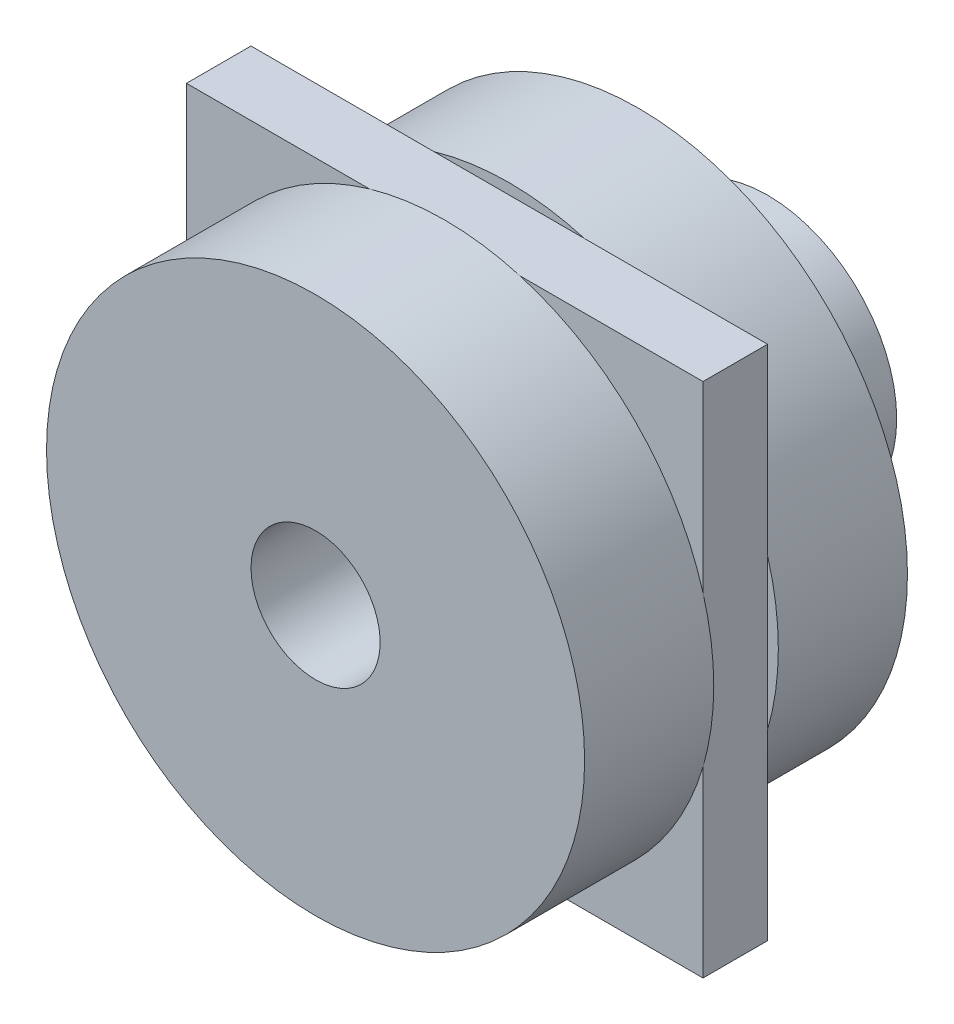
ISO-10303-21;
HEADER;
FILE_DESCRIPTION(('STEP AP214'),'2;1');
FILE_NAME('part.step','',(''),(''),'','','');
FILE_SCHEMA(('AUTOMOTIVE_DESIGN { 1 0 10303 214 1 1 1 1 }'));
ENDSEC;
DATA;
#1=APPLICATION_CONTEXT('core data for automotive mechanical design processes');
#2=APPLICATION_PROTOCOL_DEFINITION('international standard','automotive_design',2000,#1);
#3=PRODUCT_CONTEXT('',#1,'mechanical');
#4=PRODUCT('Part','Part','',(#3));
#5=PRODUCT_RELATED_PRODUCT_CATEGORY('part','',(#4));
#6=PRODUCT_DEFINITION_FORMATION('','',#4);
#7=PRODUCT_DEFINITION_CONTEXT('part definition',#1,'design');
#8=PRODUCT_DEFINITION('design','',#6,#7);
#9=PRODUCT_DEFINITION_SHAPE('','',#8);
#10=(LENGTH_UNIT() NAMED_UNIT(*) SI_UNIT(.MILLI.,.METRE.));
#11=(NAMED_UNIT(*) PLANE_ANGLE_UNIT() SI_UNIT($,.RADIAN.));
#12=(NAMED_UNIT(*) SI_UNIT($,.STERADIAN.) SOLID_ANGLE_UNIT());
#13=UNCERTAINTY_MEASURE_WITH_UNIT(LENGTH_MEASURE(1.E-05),#10,'distance_accuracy_value','');
#14=(GEOMETRIC_REPRESENTATION_CONTEXT(3) GLOBAL_UNCERTAINTY_ASSIGNED_CONTEXT((#13)) GLOBAL_UNIT_ASSIGNED_CONTEXT((#10,
#11,#12)) REPRESENTATION_CONTEXT('',''));
#15=CARTESIAN_POINT('',(0.,0.,0.));
#16=DIRECTION('',(0.,0.,1.));
#17=DIRECTION('',(1.,0.,0.));
#18=AXIS2_PLACEMENT_3D('',#15,#16,#17);
#19=CARTESIAN_POINT('',(0.,0.,9.));
#20=DIRECTION('',(0.,0.,-1.));
#21=DIRECTION('',(-1.,0.,0.));
#22=AXIS2_PLACEMENT_3D('',#19,#20,#21);
#23=PLANE('',#22);
#24=CARTESIAN_POINT('',(0.,0.,9.));
#25=DIRECTION('',(0.,0.,1.));
#26=DIRECTION('',(1.,0.,0.));
#27=AXIS2_PLACEMENT_3D('',#24,#25,#26);
#28=CIRCLE('',#27,12.5);
#29=CARTESIAN_POINT('',(12.,3.5,9.));
#30=VERTEX_POINT('',#29);
#31=CARTESIAN_POINT('',(3.5,12.,9.));
#32=VERTEX_POINT('',#31);
#33=EDGE_CURVE('E151',#30,#32,#28,.T.);
#34=ORIENTED_EDGE('',*,*,#33,.F.);
#35=DIRECTION('',(0.,1.,0.));
#36=VECTOR('',#35,1.);
#37=CARTESIAN_POINT('',(12.,-12.,9.));
#38=LINE('',#37,#36);
#39=CARTESIAN_POINT('',(12.,12.,9.));
#40=VERTEX_POINT('',#39);
#41=EDGE_CURVE('E136',#30,#40,#38,.T.);
#42=ORIENTED_EDGE('',*,*,#41,.T.);
#43=DIRECTION('',(-1.,0.,0.));
#44=VECTOR('',#43,1.);
#45=CARTESIAN_POINT('',(-12.,12.,9.));
#46=LINE('',#45,#44);
#47=EDGE_CURVE('E181',#40,#32,#46,.T.);
#48=ORIENTED_EDGE('',*,*,#47,.T.);
#49=EDGE_LOOP('',(#34,#42,#48));
#50=FACE_BOUND('',#49,.T.);
#51=ADVANCED_FACE('F35',(#50),#23,.F.);
#52=CARTESIAN_POINT('',(-3.5,12.,9.));
#53=VERTEX_POINT('',#52);
#54=CARTESIAN_POINT('',(-12.,3.5,9.));
#55=VERTEX_POINT('',#54);
#56=EDGE_CURVE('E11',#53,#55,#28,.T.);
#57=ORIENTED_EDGE('',*,*,#56,.F.);
#58=CARTESIAN_POINT('',(-12.,12.,9.));
#59=VERTEX_POINT('',#58);
#60=EDGE_CURVE('E133',#53,#59,#46,.T.);
#61=ORIENTED_EDGE('',*,*,#60,.T.);
#62=DIRECTION('',(0.,-1.,0.));
#63=VECTOR('',#62,1.);
#64=CARTESIAN_POINT('',(-12.,-12.,9.));
#65=LINE('',#64,#63);
#66=EDGE_CURVE('E178',#59,#55,#65,.T.);
#67=ORIENTED_EDGE('',*,*,#66,.T.);
#68=EDGE_LOOP('',(#57,#61,#67));
#69=FACE_BOUND('',#68,.T.);
#70=ADVANCED_FACE('F276',(#69),#23,.F.);
#71=CARTESIAN_POINT('',(-12.,-3.5,9.));
#72=VERTEX_POINT('',#71);
#73=CARTESIAN_POINT('',(-3.50000000000001,-12.,9.));
#74=VERTEX_POINT('',#73);
#75=EDGE_CURVE('E44',#72,#74,#28,.T.);
#76=ORIENTED_EDGE('',*,*,#75,.F.);
#77=CARTESIAN_POINT('',(-12.,-12.,9.));
#78=VERTEX_POINT('',#77);
#79=EDGE_CURVE('E179',#72,#78,#65,.T.);
#80=ORIENTED_EDGE('',*,*,#79,.T.);
#81=DIRECTION('',(1.,0.,0.));
#82=VECTOR('',#81,1.);
#83=CARTESIAN_POINT('',(-12.,-12.,9.));
#84=LINE('',#83,#82);
#85=EDGE_CURVE('E184',#78,#74,#84,.T.);
#86=ORIENTED_EDGE('',*,*,#85,.T.);
#87=EDGE_LOOP('',(#76,#80,#86));
#88=FACE_BOUND('',#87,.T.);
#89=ADVANCED_FACE('F282',(#88),#23,.F.);
#90=CARTESIAN_POINT('',(3.50000000000001,-12.,9.));
#91=VERTEX_POINT('',#90);
#92=CARTESIAN_POINT('',(12.,-3.5,9.));
#93=VERTEX_POINT('',#92);
#94=EDGE_CURVE('E53',#91,#93,#28,.T.);
#95=ORIENTED_EDGE('',*,*,#94,.F.);
#96=CARTESIAN_POINT('',(12.,-12.,9.));
#97=VERTEX_POINT('',#96);
#98=EDGE_CURVE('E129',#91,#97,#84,.T.);
#99=ORIENTED_EDGE('',*,*,#98,.T.);
#100=EDGE_CURVE('E126',#97,#93,#38,.T.);
#101=ORIENTED_EDGE('',*,*,#100,.T.);
#102=EDGE_LOOP('',(#95,#99,#101));
#103=FACE_BOUND('',#102,.T.);
#104=ADVANCED_FACE('F128',(#103),#23,.F.);
#105=CARTESIAN_POINT('',(0.,0.,6.));
#106=DIRECTION('',(0.,0.,1.));
#107=DIRECTION('',(1.,0.,0.));
#108=AXIS2_PLACEMENT_3D('',#105,#106,#107);
#109=PLANE('',#108);
#110=DIRECTION('',(0.,1.,0.));
#111=VECTOR('',#110,1.);
#112=CARTESIAN_POINT('',(12.,-12.,6.));
#113=LINE('',#112,#111);
#114=CARTESIAN_POINT('',(12.,-3.5,6.));
#115=VERTEX_POINT('',#114);
#116=CARTESIAN_POINT('',(12.,3.5,6.));
#117=VERTEX_POINT('',#116);
#118=EDGE_CURVE('E156',#115,#117,#113,.T.);
#119=ORIENTED_EDGE('',*,*,#118,.F.);
#120=CARTESIAN_POINT('',(0.,0.,6.));
#121=DIRECTION('',(0.,0.,1.));
#122=DIRECTION('',(1.,0.,0.));
#123=AXIS2_PLACEMENT_3D('',#120,#121,#122);
#124=CIRCLE('',#123,12.5);
#125=EDGE_CURVE('E218',#115,#117,#124,.T.);
#126=ORIENTED_EDGE('',*,*,#125,.T.);
#127=EDGE_LOOP('',(#119,#126));
#128=FACE_BOUND('',#127,.T.);
#129=ADVANCED_FACE('F287',(#128),#109,.T.);
#130=DIRECTION('',(1.,0.,0.));
#131=VECTOR('',#130,1.);
#132=CARTESIAN_POINT('',(-12.,-12.,6.));
#133=LINE('',#132,#131);
#134=CARTESIAN_POINT('',(-3.50000000000001,-12.,6.));
#135=VERTEX_POINT('',#134);
#136=CARTESIAN_POINT('',(3.50000000000001,-12.,6.));
#137=VERTEX_POINT('',#136);
#138=EDGE_CURVE('E158',#135,#137,#133,.T.);
#139=ORIENTED_EDGE('',*,*,#138,.F.);
#140=EDGE_CURVE('E227',#135,#137,#124,.T.);
#141=ORIENTED_EDGE('',*,*,#140,.T.);
#142=EDGE_LOOP('',(#139,#141));
#143=FACE_BOUND('',#142,.T.);
#144=ADVANCED_FACE('F273',(#143),#109,.T.);
#145=DIRECTION('',(0.,-1.,0.));
#146=VECTOR('',#145,1.);
#147=CARTESIAN_POINT('',(-12.,-12.,6.));
#148=LINE('',#147,#146);
#149=CARTESIAN_POINT('',(-12.,3.5,6.));
#150=VERTEX_POINT('',#149);
#151=CARTESIAN_POINT('',(-12.,-3.5,6.));
#152=VERTEX_POINT('',#151);
#153=EDGE_CURVE('E197',#150,#152,#148,.T.);
#154=ORIENTED_EDGE('',*,*,#153,.F.);
#155=EDGE_CURVE('E236',#150,#152,#124,.T.);
#156=ORIENTED_EDGE('',*,*,#155,.T.);
#157=EDGE_LOOP('',(#154,#156));
#158=FACE_BOUND('',#157,.T.);
#159=ADVANCED_FACE('F267',(#158),#109,.T.);
#160=CARTESIAN_POINT('',(0.,0.,0.));
#161=DIRECTION('',(0.,0.,1.));
#162=DIRECTION('',(1.,0.,0.));
#163=AXIS2_PLACEMENT_3D('',#160,#161,#162);
#164=PLANE('',#163);
#165=CARTESIAN_POINT('',(0.,0.,0.));
#166=DIRECTION('',(0.,0.,1.));
#167=DIRECTION('',(1.,0.,0.));
#168=AXIS2_PLACEMENT_3D('',#165,#166,#167);
#169=CIRCLE('',#168,12.5);
#170=CARTESIAN_POINT('',(12.5,0.,0.));
#171=VERTEX_POINT('',#170);
#172=EDGE_CURVE('E214',#171,#171,#169,.T.);
#173=ORIENTED_EDGE('',*,*,#172,.F.);
#174=EDGE_LOOP('',(#173));
#175=FACE_BOUND('',#174,.T.);
#176=CARTESIAN_POINT('',(0.,0.,0.));
#177=DIRECTION('',(0.,0.,1.));
#178=DIRECTION('',(1.,0.,0.));
#179=AXIS2_PLACEMENT_3D('',#176,#177,#178);
#180=CIRCLE('',#179,6.);
#181=CARTESIAN_POINT('',(6.,0.,0.));
#182=VERTEX_POINT('',#181);
#183=EDGE_CURVE('E39',#182,#182,#180,.F.);
#184=ORIENTED_EDGE('',*,*,#183,.F.);
#185=EDGE_LOOP('',(#184));
#186=FACE_BOUND('',#185,.T.);
#187=ADVANCED_FACE('F265',(#175,#186),#164,.F.);
#188=CARTESIAN_POINT('',(0.,0.,6.));
#189=DIRECTION('',(0.,0.,-1.));
#190=DIRECTION('',(-1.,0.,0.));
#191=AXIS2_PLACEMENT_3D('',#188,#189,#190);
#192=CYLINDRICAL_SURFACE('',#191,12.5);
#193=CARTESIAN_POINT('',(3.5,12.,6.));
#194=VERTEX_POINT('',#193);
#195=EDGE_CURVE('E215',#117,#194,#124,.T.);
#196=ORIENTED_EDGE('',*,*,#195,.F.);
#197=ORIENTED_EDGE('',*,*,#125,.F.);
#198=EDGE_CURVE('E222',#137,#115,#124,.T.);
#199=ORIENTED_EDGE('',*,*,#198,.F.);
#200=ORIENTED_EDGE('',*,*,#140,.F.);
#201=EDGE_CURVE('E232',#152,#135,#124,.T.);
#202=ORIENTED_EDGE('',*,*,#201,.F.);
#203=ORIENTED_EDGE('',*,*,#155,.F.);
#204=CARTESIAN_POINT('',(-3.5,12.,6.));
#205=VERTEX_POINT('',#204);
#206=EDGE_CURVE('E241',#205,#150,#124,.T.);
#207=ORIENTED_EDGE('',*,*,#206,.F.);
#208=EDGE_CURVE('E217',#194,#205,#124,.T.);
#209=ORIENTED_EDGE('',*,*,#208,.F.);
#210=EDGE_LOOP('',(#196,#197,#199,#200,#202,#203,#207,#209));
#211=FACE_BOUND('',#210,.T.);
#212=ORIENTED_EDGE('',*,*,#172,.T.);
#213=EDGE_LOOP('',(#212));
#214=FACE_BOUND('',#213,.T.);
#215=ADVANCED_FACE('F37',(#211,#214),#192,.T.);
#216=DIRECTION('',(-1.,0.,0.));
#217=VECTOR('',#216,1.);
#218=CARTESIAN_POINT('',(-12.,12.,6.));
#219=LINE('',#218,#217);
#220=EDGE_CURVE('E192',#194,#205,#219,.T.);
#221=ORIENTED_EDGE('',*,*,#220,.F.);
#222=ORIENTED_EDGE('',*,*,#208,.T.);
#223=EDGE_LOOP('',(#221,#222));
#224=FACE_BOUND('',#223,.T.);
#225=ADVANCED_FACE('F251',(#224),#109,.T.);
#226=CARTESIAN_POINT('',(0.,0.,-6.));
#227=DIRECTION('',(0.,0.,1.));
#228=DIRECTION('',(1.,0.,0.));
#229=AXIS2_PLACEMENT_3D('',#226,#227,#228);
#230=CYLINDRICAL_SURFACE('',#229,6.);
#231=CARTESIAN_POINT('',(0.,0.,-6.));
#232=DIRECTION('',(0.,0.,-1.));
#233=DIRECTION('',(-1.,0.,0.));
#234=AXIS2_PLACEMENT_3D('',#231,#232,#233);
#235=CIRCLE('',#234,6.);
#236=CARTESIAN_POINT('',(-6.,0.,-6.));
#237=VERTEX_POINT('',#236);
#238=EDGE_CURVE('E211',#237,#237,#235,.T.);
#239=ORIENTED_EDGE('',*,*,#238,.F.);
#240=EDGE_LOOP('',(#239));
#241=FACE_BOUND('',#240,.T.);
#242=ORIENTED_EDGE('',*,*,#183,.T.);
#243=EDGE_LOOP('',(#242));
#244=FACE_BOUND('',#243,.T.);
#245=ADVANCED_FACE('F263',(#241,#244),#230,.T.);
#246=CARTESIAN_POINT('',(0.,0.,-6.));
#247=DIRECTION('',(0.,0.,-1.));
#248=DIRECTION('',(-1.,0.,0.));
#249=AXIS2_PLACEMENT_3D('',#246,#247,#248);
#250=PLANE('',#249);
#251=CARTESIAN_POINT('',(0.,0.,-6.));
#252=DIRECTION('',(0.,0.,-1.));
#253=DIRECTION('',(-1.,0.,0.));
#254=AXIS2_PLACEMENT_3D('',#251,#252,#253);
#255=CIRCLE('',#254,3.);
#256=CARTESIAN_POINT('',(-3.,0.,-6.));
#257=VERTEX_POINT('',#256);
#258=EDGE_CURVE('E439',#257,#257,#255,.T.);
#259=ORIENTED_EDGE('',*,*,#258,.F.);
#260=EDGE_LOOP('',(#259));
#261=FACE_BOUND('',#260,.T.);
#262=ORIENTED_EDGE('',*,*,#238,.T.);
#263=EDGE_LOOP('',(#262));
#264=FACE_BOUND('',#263,.T.);
#265=ADVANCED_FACE('F314',(#261,#264),#250,.T.);
#266=CARTESIAN_POINT('',(0.,0.,6.));
#267=DIRECTION('',(0.,0.,-1.));
#268=DIRECTION('',(-1.,0.,0.));
#269=AXIS2_PLACEMENT_3D('',#266,#267,#268);
#270=PLANE('',#269);
#271=CARTESIAN_POINT('',(12.,12.,6.));
#272=VERTEX_POINT('',#271);
#273=EDGE_CURVE('E161',#117,#272,#113,.T.);
#274=ORIENTED_EDGE('',*,*,#273,.F.);
#275=ORIENTED_EDGE('',*,*,#195,.T.);
#276=EDGE_CURVE('E188',#272,#194,#219,.T.);
#277=ORIENTED_EDGE('',*,*,#276,.F.);
#278=EDGE_LOOP('',(#274,#275,#277));
#279=FACE_BOUND('',#278,.T.);
#280=ADVANCED_FACE('F306',(#279),#270,.T.);
#281=CARTESIAN_POINT('',(-12.,12.,6.));
#282=VERTEX_POINT('',#281);
#283=EDGE_CURVE('E187',#205,#282,#219,.T.);
#284=ORIENTED_EDGE('',*,*,#283,.F.);
#285=ORIENTED_EDGE('',*,*,#206,.T.);
#286=EDGE_CURVE('E193',#282,#150,#148,.T.);
#287=ORIENTED_EDGE('',*,*,#286,.F.);
#288=EDGE_LOOP('',(#284,#285,#287));
#289=FACE_BOUND('',#288,.T.);
#290=ADVANCED_FACE('F254',(#289),#270,.T.);
#291=CARTESIAN_POINT('',(-12.,-12.,6.));
#292=VERTEX_POINT('',#291);
#293=EDGE_CURVE('E191',#152,#292,#148,.T.);
#294=ORIENTED_EDGE('',*,*,#293,.F.);
#295=ORIENTED_EDGE('',*,*,#201,.T.);
#296=EDGE_CURVE('E198',#292,#135,#133,.T.);
#297=ORIENTED_EDGE('',*,*,#296,.F.);
#298=EDGE_LOOP('',(#294,#295,#297));
#299=FACE_BOUND('',#298,.T.);
#300=ADVANCED_FACE('F307',(#299),#270,.T.);
#301=CARTESIAN_POINT('',(12.,-12.,9.));
#302=DIRECTION('',(-1.,0.,0.));
#303=DIRECTION('',(0.,0.,1.));
#304=AXIS2_PLACEMENT_3D('',#301,#302,#303);
#305=PLANE('',#304);
#306=CARTESIAN_POINT('',(12.,-12.,6.));
#307=VERTEX_POINT('',#306);
#308=EDGE_CURVE('E160',#307,#115,#113,.T.);
#309=ORIENTED_EDGE('',*,*,#308,.T.);
#310=ORIENTED_EDGE('',*,*,#118,.T.);
#311=ORIENTED_EDGE('',*,*,#273,.T.);
#312=DIRECTION('',(0.,0.,-1.));
#313=VECTOR('',#312,1.);
#314=CARTESIAN_POINT('',(12.,12.,9.));
#315=LINE('',#314,#313);
#316=EDGE_CURVE('E208',#40,#272,#315,.T.);
#317=ORIENTED_EDGE('',*,*,#316,.F.);
#318=ORIENTED_EDGE('',*,*,#41,.F.);
#319=EDGE_CURVE('E134',#93,#30,#38,.T.);
#320=ORIENTED_EDGE('',*,*,#319,.F.);
#321=ORIENTED_EDGE('',*,*,#100,.F.);
#322=DIRECTION('',(0.,0.,-1.));
#323=VECTOR('',#322,1.);
#324=CARTESIAN_POINT('',(12.,-12.,9.));
#325=LINE('',#324,#323);
#326=EDGE_CURVE('E185',#97,#307,#325,.T.);
#327=ORIENTED_EDGE('',*,*,#326,.T.);
#328=EDGE_LOOP('',(#309,#310,#311,#317,#318,#320,#321,#327));
#329=FACE_BOUND('',#328,.T.);
#330=ADVANCED_FACE('F141',(#329),#305,.F.);
#331=CARTESIAN_POINT('',(-12.,12.,9.));
#332=DIRECTION('',(0.,-1.,0.));
#333=DIRECTION('',(0.,0.,-1.));
#334=AXIS2_PLACEMENT_3D('',#331,#332,#333);
#335=PLANE('',#334);
#336=ORIENTED_EDGE('',*,*,#276,.T.);
#337=ORIENTED_EDGE('',*,*,#220,.T.);
#338=ORIENTED_EDGE('',*,*,#283,.T.);
#339=DIRECTION('',(0.,0.,-1.));
#340=VECTOR('',#339,1.);
#341=CARTESIAN_POINT('',(-12.,12.,9.));
#342=LINE('',#341,#340);
#343=EDGE_CURVE('E205',#59,#282,#342,.T.);
#344=ORIENTED_EDGE('',*,*,#343,.F.);
#345=ORIENTED_EDGE('',*,*,#60,.F.);
#346=EDGE_CURVE('E447',#32,#53,#46,.T.);
#347=ORIENTED_EDGE('',*,*,#346,.F.);
#348=ORIENTED_EDGE('',*,*,#47,.F.);
#349=ORIENTED_EDGE('',*,*,#316,.T.);
#350=EDGE_LOOP('',(#336,#337,#338,#344,#345,#347,#348,#349));
#351=FACE_BOUND('',#350,.T.);
#352=ADVANCED_FACE('F257',(#351),#335,.F.);
#353=CARTESIAN_POINT('',(-12.,-12.,9.));
#354=DIRECTION('',(1.,0.,0.));
#355=DIRECTION('',(0.,0.,-1.));
#356=AXIS2_PLACEMENT_3D('',#353,#354,#355);
#357=PLANE('',#356);
#358=ORIENTED_EDGE('',*,*,#286,.T.);
#359=ORIENTED_EDGE('',*,*,#153,.T.);
#360=ORIENTED_EDGE('',*,*,#293,.T.);
#361=DIRECTION('',(0.,0.,-1.));
#362=VECTOR('',#361,1.);
#363=CARTESIAN_POINT('',(-12.,-12.,9.));
#364=LINE('',#363,#362);
#365=EDGE_CURVE('E202',#78,#292,#364,.T.);
#366=ORIENTED_EDGE('',*,*,#365,.F.);
#367=ORIENTED_EDGE('',*,*,#79,.F.);
#368=EDGE_CURVE('E173',#55,#72,#65,.T.);
#369=ORIENTED_EDGE('',*,*,#368,.F.);
#370=ORIENTED_EDGE('',*,*,#66,.F.);
#371=ORIENTED_EDGE('',*,*,#343,.T.);
#372=EDGE_LOOP('',(#358,#359,#360,#366,#367,#369,#370,#371));
#373=FACE_BOUND('',#372,.T.);
#374=ADVANCED_FACE('F296',(#373),#357,.F.);
#375=CARTESIAN_POINT('',(-12.,-12.,9.));
#376=DIRECTION('',(0.,1.,0.));
#377=DIRECTION('',(0.,0.,1.));
#378=AXIS2_PLACEMENT_3D('',#375,#376,#377);
#379=PLANE('',#378);
#380=ORIENTED_EDGE('',*,*,#296,.T.);
#381=ORIENTED_EDGE('',*,*,#138,.T.);
#382=EDGE_CURVE('E196',#137,#307,#133,.T.);
#383=ORIENTED_EDGE('',*,*,#382,.T.);
#384=ORIENTED_EDGE('',*,*,#326,.F.);
#385=ORIENTED_EDGE('',*,*,#98,.F.);
#386=EDGE_CURVE('E60',#74,#91,#84,.T.);
#387=ORIENTED_EDGE('',*,*,#386,.F.);
#388=ORIENTED_EDGE('',*,*,#85,.F.);
#389=ORIENTED_EDGE('',*,*,#365,.T.);
#390=EDGE_LOOP('',(#380,#381,#383,#384,#385,#387,#388,#389));
#391=FACE_BOUND('',#390,.T.);
#392=ADVANCED_FACE('F297',(#391),#379,.F.);
#393=ORIENTED_EDGE('',*,*,#382,.F.);
#394=ORIENTED_EDGE('',*,*,#198,.T.);
#395=ORIENTED_EDGE('',*,*,#308,.F.);
#396=EDGE_LOOP('',(#393,#394,#395));
#397=FACE_BOUND('',#396,.T.);
#398=ADVANCED_FACE('F300',(#397),#270,.T.);
#399=CARTESIAN_POINT('',(0.,0.,9.));
#400=DIRECTION('',(0.,0.,1.));
#401=DIRECTION('',(1.,0.,0.));
#402=AXIS2_PLACEMENT_3D('',#399,#400,#401);
#403=PLANE('',#402);
#404=EDGE_CURVE('E145',#93,#30,#28,.T.);
#405=ORIENTED_EDGE('',*,*,#404,.F.);
#406=ORIENTED_EDGE('',*,*,#319,.T.);
#407=EDGE_LOOP('',(#405,#406));
#408=FACE_BOUND('',#407,.T.);
#409=ADVANCED_FACE('F146',(#408),#403,.F.);
#410=EDGE_CURVE('E46',#32,#53,#28,.T.);
#411=ORIENTED_EDGE('',*,*,#410,.F.);
#412=ORIENTED_EDGE('',*,*,#346,.T.);
#413=EDGE_LOOP('',(#411,#412));
#414=FACE_BOUND('',#413,.T.);
#415=ADVANCED_FACE('F379',(#414),#403,.F.);
#416=EDGE_CURVE('E166',#55,#72,#28,.T.);
#417=ORIENTED_EDGE('',*,*,#416,.F.);
#418=ORIENTED_EDGE('',*,*,#368,.T.);
#419=EDGE_LOOP('',(#417,#418));
#420=FACE_BOUND('',#419,.T.);
#421=ADVANCED_FACE('F172',(#420),#403,.F.);
#422=EDGE_CURVE('E149',#74,#91,#28,.T.);
#423=ORIENTED_EDGE('',*,*,#422,.F.);
#424=ORIENTED_EDGE('',*,*,#386,.T.);
#425=EDGE_LOOP('',(#423,#424));
#426=FACE_BOUND('',#425,.T.);
#427=ADVANCED_FACE('F381',(#426),#403,.F.);
#428=CARTESIAN_POINT('',(0.,0.,15.));
#429=DIRECTION('',(0.,0.,-1.));
#430=DIRECTION('',(-1.,0.,0.));
#431=AXIS2_PLACEMENT_3D('',#428,#429,#430);
#432=CYLINDRICAL_SURFACE('',#431,12.5);
#433=CARTESIAN_POINT('',(0.,0.,15.));
#434=DIRECTION('',(0.,0.,1.));
#435=DIRECTION('',(1.,0.,0.));
#436=AXIS2_PLACEMENT_3D('',#433,#434,#435);
#437=CIRCLE('',#436,12.5);
#438=CARTESIAN_POINT('',(12.5,0.,15.));
#439=VERTEX_POINT('',#438);
#440=EDGE_CURVE('E163',#439,#439,#437,.T.);
#441=ORIENTED_EDGE('',*,*,#440,.F.);
#442=EDGE_LOOP('',(#441));
#443=FACE_BOUND('',#442,.T.);
#444=ORIENTED_EDGE('',*,*,#33,.T.);
#445=ORIENTED_EDGE('',*,*,#410,.T.);
#446=ORIENTED_EDGE('',*,*,#56,.T.);
#447=ORIENTED_EDGE('',*,*,#416,.T.);
#448=ORIENTED_EDGE('',*,*,#75,.T.);
#449=ORIENTED_EDGE('',*,*,#422,.T.);
#450=ORIENTED_EDGE('',*,*,#94,.T.);
#451=ORIENTED_EDGE('',*,*,#404,.T.);
#452=EDGE_LOOP('',(#444,#445,#446,#447,#448,#449,#450,#451));
#453=FACE_BOUND('',#452,.T.);
#454=ADVANCED_FACE('F153',(#443,#453),#432,.T.);
#455=CARTESIAN_POINT('',(0.,0.,15.));
#456=DIRECTION('',(0.,0.,1.));
#457=DIRECTION('',(1.,0.,0.));
#458=AXIS2_PLACEMENT_3D('',#455,#456,#457);
#459=PLANE('',#458);
#460=CARTESIAN_POINT('',(0.,0.,15.));
#461=DIRECTION('',(0.,0.,-1.));
#462=DIRECTION('',(-1.,0.,0.));
#463=AXIS2_PLACEMENT_3D('',#460,#461,#462);
#464=CIRCLE('',#463,3.);
#465=CARTESIAN_POINT('',(-3.,0.,15.));
#466=VERTEX_POINT('',#465);
#467=EDGE_CURVE('E150',#466,#466,#464,.T.);
#468=ORIENTED_EDGE('',*,*,#467,.T.);
#469=EDGE_LOOP('',(#468));
#470=FACE_BOUND('',#469,.T.);
#471=ORIENTED_EDGE('',*,*,#440,.T.);
#472=EDGE_LOOP('',(#471));
#473=FACE_BOUND('',#472,.T.);
#474=ADVANCED_FACE('F411',(#470,#473),#459,.T.);
#475=CARTESIAN_POINT('',(0.,0.,15.));
#476=DIRECTION('',(0.,0.,-1.));
#477=DIRECTION('',(-1.,0.,0.));
#478=AXIS2_PLACEMENT_3D('',#475,#476,#477);
#479=CYLINDRICAL_SURFACE('',#478,3.);
#480=CARTESIAN_POINT('',(-3.,0.,15.));
#481=CARTESIAN_POINT('',(-3.,0.,14.78125));
#482=CARTESIAN_POINT('',(-3.,0.,14.5625));
#483=CARTESIAN_POINT('',(-3.,0.,14.125));
#484=CARTESIAN_POINT('',(-3.,0.,13.90625));
#485=CARTESIAN_POINT('',(-3.,0.,13.46875));
#486=CARTESIAN_POINT('',(-3.,0.,13.25));
#487=CARTESIAN_POINT('',(-3.,0.,12.8125));
#488=CARTESIAN_POINT('',(-3.,0.,12.59375));
#489=CARTESIAN_POINT('',(-3.,0.,12.15625));
#490=CARTESIAN_POINT('',(-3.,0.,11.9375));
#491=CARTESIAN_POINT('',(-3.,0.,11.5));
#492=CARTESIAN_POINT('',(-3.,0.,11.28125));
#493=CARTESIAN_POINT('',(-3.,0.,10.84375));
#494=CARTESIAN_POINT('',(-3.,0.,10.625));
#495=CARTESIAN_POINT('',(-3.,0.,10.1875));
#496=CARTESIAN_POINT('',(-3.,0.,9.96875));
#497=CARTESIAN_POINT('',(-3.,0.,9.53125));
#498=CARTESIAN_POINT('',(-3.,0.,9.3125));
#499=CARTESIAN_POINT('',(-3.,0.,8.875));
#500=CARTESIAN_POINT('',(-3.,0.,8.65625));
#501=CARTESIAN_POINT('',(-3.,0.,8.21875));
#502=CARTESIAN_POINT('',(-3.,0.,8.));
#503=CARTESIAN_POINT('',(-3.,0.,7.5625));
#504=CARTESIAN_POINT('',(-3.,0.,7.34375));
#505=CARTESIAN_POINT('',(-3.,0.,6.90625));
#506=CARTESIAN_POINT('',(-3.,0.,6.6875));
#507=CARTESIAN_POINT('',(-3.,0.,6.25));
#508=CARTESIAN_POINT('',(-3.,0.,6.03125));
#509=CARTESIAN_POINT('',(-3.,0.,5.59375));
#510=CARTESIAN_POINT('',(-3.,0.,5.375));
#511=CARTESIAN_POINT('',(-3.,0.,4.9375));
#512=CARTESIAN_POINT('',(-3.,0.,4.71875));
#513=CARTESIAN_POINT('',(-3.,0.,4.28125));
#514=CARTESIAN_POINT('',(-3.,0.,4.0625));
#515=CARTESIAN_POINT('',(-3.,0.,3.625));
#516=CARTESIAN_POINT('',(-3.,0.,3.40625));
#517=CARTESIAN_POINT('',(-3.,0.,2.96875));
#518=CARTESIAN_POINT('',(-3.,0.,2.75));
#519=CARTESIAN_POINT('',(-3.,0.,2.3125));
#520=CARTESIAN_POINT('',(-3.,0.,2.09375));
#521=CARTESIAN_POINT('',(-3.,0.,1.65625));
#522=CARTESIAN_POINT('',(-3.,0.,1.4375));
#523=CARTESIAN_POINT('',(-3.,0.,1.));
#524=CARTESIAN_POINT('',(-3.,0.,0.78125));
#525=CARTESIAN_POINT('',(-3.,0.,0.34375));
#526=CARTESIAN_POINT('',(-3.,0.,0.125));
#527=CARTESIAN_POINT('',(-3.,0.,-0.3125));
#528=CARTESIAN_POINT('',(-3.,0.,-0.531249999999999));
#529=CARTESIAN_POINT('',(-3.,0.,-0.968749999999999));
#530=CARTESIAN_POINT('',(-3.,0.,-1.1875));
#531=CARTESIAN_POINT('',(-3.,0.,-1.625));
#532=CARTESIAN_POINT('',(-3.,0.,-1.84375));
#533=CARTESIAN_POINT('',(-3.,0.,-2.28125));
#534=CARTESIAN_POINT('',(-3.,0.,-2.5));
#535=CARTESIAN_POINT('',(-3.,0.,-2.9375));
#536=CARTESIAN_POINT('',(-3.,0.,-3.15625));
#537=CARTESIAN_POINT('',(-3.,0.,-3.59375));
#538=CARTESIAN_POINT('',(-3.,0.,-3.8125));
#539=CARTESIAN_POINT('',(-3.,0.,-4.25));
#540=CARTESIAN_POINT('',(-3.,0.,-4.46875));
#541=CARTESIAN_POINT('',(-3.,0.,-4.90625));
#542=CARTESIAN_POINT('',(-3.,0.,-5.125));
#543=CARTESIAN_POINT('',(-3.,0.,-5.5625));
#544=CARTESIAN_POINT('',(-3.,0.,-5.78125));
#545=CARTESIAN_POINT('',(-3.,0.,-6.));
#546=B_SPLINE_CURVE_WITH_KNOTS('',3,(#480,#481,#482,#483,#484,#485,#486,#487,#488,#489,#490,
#491,#492,#493,#494,#495,#496,#497,#498,#499,#500,#501,#502,#503,#504,#505,#506,#507,#508,#509,
#510,#511,#512,#513,#514,#515,#516,#517,#518,#519,#520,#521,#522,#523,#524,#525,#526,#527,#528,
#529,#530,#531,#532,#533,#534,#535,#536,#537,#538,#539,#540,#541,#542,#543,#544,#545),
.UNSPECIFIED.,.F.,.F.,(4,2,2,2,2,2,2,2,2,2,2,2,2,2,2,2,2,2,2,2,2,2,2,2,2,2,2,2,2,2,2,2,4),(0.,
0.656249999999999,1.3125,1.96875,2.625,3.28125,3.9375,4.59375,5.25,5.90625,6.5625,7.21875,7.875,
8.53125,9.1875,9.84375,10.5,11.15625,11.8125,12.46875,13.125,13.78125,14.4375,15.09375,15.75,
16.40625,17.0625,17.71875,18.375,19.03125,19.6875,20.34375,21.),.UNSPECIFIED.);
#547=EDGE_CURVE('BSEAM420',#466,#257,#546,.T.);
#548=ORIENTED_EDGE('',*,*,#467,.F.);
#549=ORIENTED_EDGE('',*,*,#258,.T.);
#550=ORIENTED_EDGE('',*,*,#547,.T.);
#551=ORIENTED_EDGE('',*,*,#547,.F.);
#552=EDGE_LOOP('',(#548,#550,#549,#551));
#553=FACE_BOUND('',#552,.T.);
#554=ADVANCED_FACE('F420',(#553),#479,.F.);
#555=CLOSED_SHELL('',(#51,#70,#89,#104,#129,#144,#159,#187,#215,#225,#245,#265,#280,#290,#300,
#330,#352,#374,#392,#398,#409,#415,#421,#427,#454,#474,#554));
#556=MANIFOLD_SOLID_BREP('B2',#555);
#557=ADVANCED_BREP_SHAPE_REPRESENTATION('',(#18,#556),#14);
#558=SHAPE_DEFINITION_REPRESENTATION(#9,#557);
ENDSEC;
END-ISO-10303-21;
